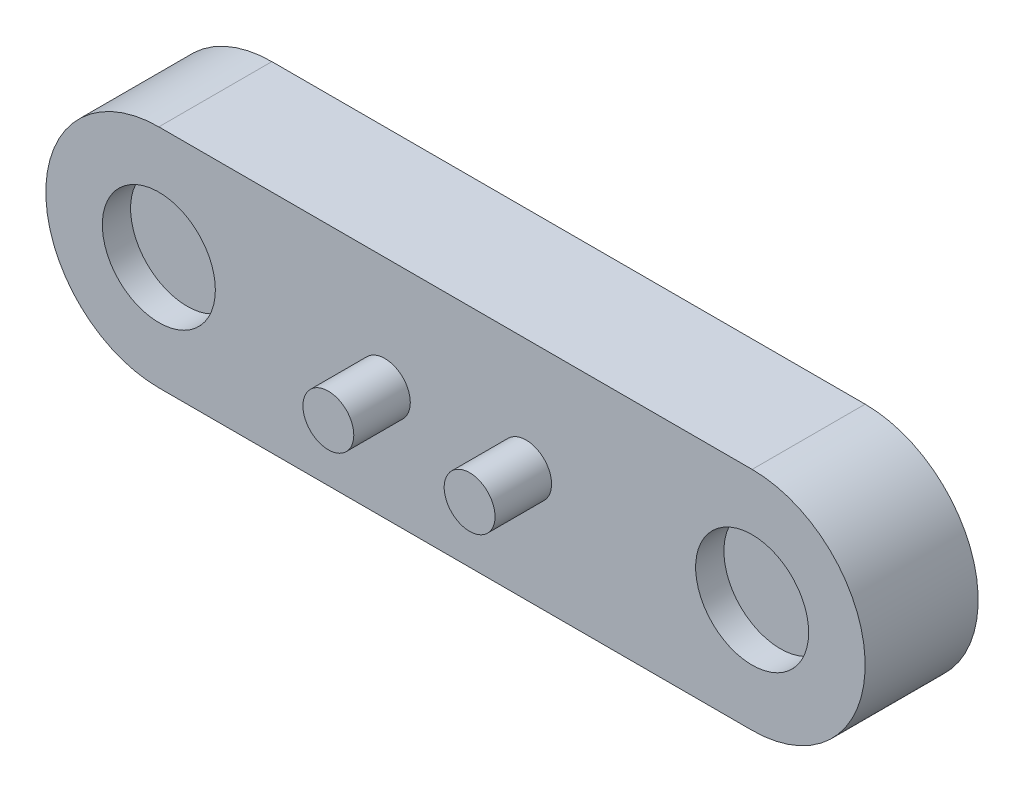
ISO-10303-21;
HEADER;
FILE_DESCRIPTION(('STEP AP214'),'2;1');
FILE_NAME('part.step','',(''),(''),'','','');
FILE_SCHEMA(('AUTOMOTIVE_DESIGN { 1 0 10303 214 1 1 1 1 }'));
ENDSEC;
DATA;
#1=APPLICATION_CONTEXT('core data for automotive mechanical design processes');
#2=APPLICATION_PROTOCOL_DEFINITION('international standard','automotive_design',2000,#1);
#3=PRODUCT_CONTEXT('',#1,'mechanical');
#4=PRODUCT('Part','Part','',(#3));
#5=PRODUCT_RELATED_PRODUCT_CATEGORY('part','',(#4));
#6=PRODUCT_DEFINITION_FORMATION('','',#4);
#7=PRODUCT_DEFINITION_CONTEXT('part definition',#1,'design');
#8=PRODUCT_DEFINITION('design','',#6,#7);
#9=PRODUCT_DEFINITION_SHAPE('','',#8);
#10=(LENGTH_UNIT() NAMED_UNIT(*) SI_UNIT(.MILLI.,.METRE.));
#11=(NAMED_UNIT(*) PLANE_ANGLE_UNIT() SI_UNIT($,.RADIAN.));
#12=(NAMED_UNIT(*) SI_UNIT($,.STERADIAN.) SOLID_ANGLE_UNIT());
#13=UNCERTAINTY_MEASURE_WITH_UNIT(LENGTH_MEASURE(1.E-05),#10,'distance_accuracy_value','');
#14=(GEOMETRIC_REPRESENTATION_CONTEXT(3) GLOBAL_UNCERTAINTY_ASSIGNED_CONTEXT((#13)) GLOBAL_UNIT_ASSIGNED_CONTEXT((#10,
#11,#12)) REPRESENTATION_CONTEXT('',''));
#15=CARTESIAN_POINT('',(0.,0.,0.));
#16=DIRECTION('',(0.,0.,1.));
#17=DIRECTION('',(1.,0.,0.));
#18=AXIS2_PLACEMENT_3D('',#15,#16,#17);
#19=CARTESIAN_POINT('',(10.5,0.,-2.));
#20=DIRECTION('',(0.,0.,1.));
#21=DIRECTION('',(1.,0.,0.));
#22=AXIS2_PLACEMENT_3D('',#19,#20,#21);
#23=CYLINDRICAL_SURFACE('',#22,2.);
#24=CARTESIAN_POINT('',(10.5,0.,0.));
#25=DIRECTION('',(0.,0.,1.));
#26=DIRECTION('',(1.,0.,0.));
#27=AXIS2_PLACEMENT_3D('',#24,#25,#26);
#28=CIRCLE('',#27,2.);
#29=CARTESIAN_POINT('',(10.5,-2.,0.));
#30=VERTEX_POINT('',#29);
#31=CARTESIAN_POINT('',(10.5,2.,0.));
#32=VERTEX_POINT('',#31);
#33=EDGE_CURVE('E110',#30,#32,#28,.T.);
#34=ORIENTED_EDGE('',*,*,#33,.F.);
#35=DIRECTION('',(0.,0.,1.));
#36=VECTOR('',#35,1.);
#37=CARTESIAN_POINT('',(10.5,-2.,-2.));
#38=LINE('',#37,#36);
#39=CARTESIAN_POINT('',(10.5,-2.,-2.));
#40=VERTEX_POINT('',#39);
#41=EDGE_CURVE('E11',#40,#30,#38,.T.);
#42=ORIENTED_EDGE('',*,*,#41,.F.);
#43=CARTESIAN_POINT('',(10.5,0.,-2.));
#44=DIRECTION('',(0.,0.,1.));
#45=DIRECTION('',(1.,0.,0.));
#46=AXIS2_PLACEMENT_3D('',#43,#44,#45);
#47=CIRCLE('',#46,2.);
#48=CARTESIAN_POINT('',(10.5,2.,-2.));
#49=VERTEX_POINT('',#48);
#50=EDGE_CURVE('E103',#40,#49,#47,.T.);
#51=ORIENTED_EDGE('',*,*,#50,.T.);
#52=DIRECTION('',(0.,0.,1.));
#53=VECTOR('',#52,1.);
#54=CARTESIAN_POINT('',(10.5,2.,-2.));
#55=LINE('',#54,#53);
#56=EDGE_CURVE('E48',#49,#32,#55,.T.);
#57=ORIENTED_EDGE('',*,*,#56,.T.);
#58=EDGE_LOOP('',(#34,#42,#51,#57));
#59=FACE_BOUND('',#58,.T.);
#60=ADVANCED_FACE('F45',(#59),#23,.T.);
#61=CARTESIAN_POINT('',(10.5,-2.,-2.));
#62=DIRECTION('',(0.,-1.,0.));
#63=DIRECTION('',(1.,0.,0.));
#64=AXIS2_PLACEMENT_3D('',#61,#62,#63);
#65=PLANE('',#64);
#66=DIRECTION('',(1.,0.,0.));
#67=VECTOR('',#66,1.);
#68=CARTESIAN_POINT('',(10.5,-2.,0.));
#69=LINE('',#68,#67);
#70=CARTESIAN_POINT('',(0.,-2.,0.));
#71=VERTEX_POINT('',#70);
#72=EDGE_CURVE('E105',#71,#30,#69,.T.);
#73=ORIENTED_EDGE('',*,*,#72,.F.);
#74=DIRECTION('',(0.,0.,1.));
#75=VECTOR('',#74,1.);
#76=CARTESIAN_POINT('',(0.,-2.,-2.));
#77=LINE('',#76,#75);
#78=CARTESIAN_POINT('',(0.,-2.,-2.));
#79=VERTEX_POINT('',#78);
#80=EDGE_CURVE('E54',#79,#71,#77,.T.);
#81=ORIENTED_EDGE('',*,*,#80,.F.);
#82=DIRECTION('',(1.,0.,0.));
#83=VECTOR('',#82,1.);
#84=CARTESIAN_POINT('',(10.5,-2.,-2.));
#85=LINE('',#84,#83);
#86=EDGE_CURVE('E100',#79,#40,#85,.T.);
#87=ORIENTED_EDGE('',*,*,#86,.T.);
#88=ORIENTED_EDGE('',*,*,#41,.T.);
#89=EDGE_LOOP('',(#73,#81,#87,#88));
#90=FACE_BOUND('',#89,.T.);
#91=ADVANCED_FACE('F121',(#90),#65,.T.);
#92=CARTESIAN_POINT('',(0.,0.,-2.));
#93=DIRECTION('',(0.,0.,1.));
#94=DIRECTION('',(1.,0.,0.));
#95=AXIS2_PLACEMENT_3D('',#92,#93,#94);
#96=CYLINDRICAL_SURFACE('',#95,2.);
#97=CARTESIAN_POINT('',(0.,0.,0.));
#98=DIRECTION('',(0.,0.,1.));
#99=DIRECTION('',(1.,0.,0.));
#100=AXIS2_PLACEMENT_3D('',#97,#98,#99);
#101=CIRCLE('',#100,2.);
#102=CARTESIAN_POINT('',(0.,2.,0.));
#103=VERTEX_POINT('',#102);
#104=EDGE_CURVE('E95',#103,#71,#101,.T.);
#105=ORIENTED_EDGE('',*,*,#104,.F.);
#106=DIRECTION('',(0.,0.,1.));
#107=VECTOR('',#106,1.);
#108=CARTESIAN_POINT('',(0.,2.,-2.));
#109=LINE('',#108,#107);
#110=CARTESIAN_POINT('',(0.,2.,-2.));
#111=VERTEX_POINT('',#110);
#112=EDGE_CURVE('E90',#111,#103,#109,.T.);
#113=ORIENTED_EDGE('',*,*,#112,.F.);
#114=CARTESIAN_POINT('',(0.,0.,-2.));
#115=DIRECTION('',(0.,0.,1.));
#116=DIRECTION('',(1.,0.,0.));
#117=AXIS2_PLACEMENT_3D('',#114,#115,#116);
#118=CIRCLE('',#117,2.);
#119=EDGE_CURVE('E93',#111,#79,#118,.T.);
#120=ORIENTED_EDGE('',*,*,#119,.T.);
#121=ORIENTED_EDGE('',*,*,#80,.T.);
#122=EDGE_LOOP('',(#105,#113,#120,#121));
#123=FACE_BOUND('',#122,.T.);
#124=ADVANCED_FACE('F92',(#123),#96,.T.);
#125=CARTESIAN_POINT('',(10.5,2.,-2.));
#126=DIRECTION('',(0.,1.,0.));
#127=DIRECTION('',(-1.,0.,0.));
#128=AXIS2_PLACEMENT_3D('',#125,#126,#127);
#129=PLANE('',#128);
#130=DIRECTION('',(-1.,0.,0.));
#131=VECTOR('',#130,1.);
#132=CARTESIAN_POINT('',(10.5,2.,0.));
#133=LINE('',#132,#131);
#134=EDGE_CURVE('E113',#32,#103,#133,.T.);
#135=ORIENTED_EDGE('',*,*,#134,.F.);
#136=ORIENTED_EDGE('',*,*,#56,.F.);
#137=DIRECTION('',(-1.,0.,0.));
#138=VECTOR('',#137,1.);
#139=CARTESIAN_POINT('',(10.5,2.,-2.));
#140=LINE('',#139,#138);
#141=EDGE_CURVE('E99',#49,#111,#140,.T.);
#142=ORIENTED_EDGE('',*,*,#141,.T.);
#143=ORIENTED_EDGE('',*,*,#112,.T.);
#144=EDGE_LOOP('',(#135,#136,#142,#143));
#145=FACE_BOUND('',#144,.T.);
#146=ADVANCED_FACE('F102',(#145),#129,.T.);
#147=CARTESIAN_POINT('',(10.5,0.,-2.));
#148=DIRECTION('',(0.,0.,1.));
#149=DIRECTION('',(1.,0.,0.));
#150=AXIS2_PLACEMENT_3D('',#147,#148,#149);
#151=PLANE('',#150);
#152=ORIENTED_EDGE('',*,*,#50,.F.);
#153=ORIENTED_EDGE('',*,*,#86,.F.);
#154=ORIENTED_EDGE('',*,*,#119,.F.);
#155=ORIENTED_EDGE('',*,*,#141,.F.);
#156=EDGE_LOOP('',(#152,#153,#154,#155));
#157=FACE_BOUND('',#156,.T.);
#158=ADVANCED_FACE('F98',(#157),#151,.F.);
#159=CARTESIAN_POINT('',(10.5,0.,0.));
#160=DIRECTION('',(0.,0.,1.));
#161=DIRECTION('',(1.,0.,0.));
#162=AXIS2_PLACEMENT_3D('',#159,#160,#161);
#163=PLANE('',#162);
#164=CARTESIAN_POINT('',(6.5,0.,0.));
#165=DIRECTION('',(0.,0.,1.));
#166=DIRECTION('',(1.,0.,0.));
#167=AXIS2_PLACEMENT_3D('',#164,#165,#166);
#168=CIRCLE('',#167,0.45);
#169=CARTESIAN_POINT('',(6.95,0.,0.));
#170=VERTEX_POINT('',#169);
#171=EDGE_CURVE('E179',#170,#170,#168,.T.);
#172=ORIENTED_EDGE('',*,*,#171,.F.);
#173=EDGE_LOOP('',(#172));
#174=FACE_BOUND('',#173,.T.);
#175=CARTESIAN_POINT('',(4.,0.,0.));
#176=DIRECTION('',(0.,0.,1.));
#177=DIRECTION('',(1.,0.,0.));
#178=AXIS2_PLACEMENT_3D('',#175,#176,#177);
#179=CIRCLE('',#178,0.45);
#180=CARTESIAN_POINT('',(4.45,0.,0.));
#181=VERTEX_POINT('',#180);
#182=EDGE_CURVE('E180',#181,#181,#179,.T.);
#183=ORIENTED_EDGE('',*,*,#182,.F.);
#184=EDGE_LOOP('',(#183));
#185=FACE_BOUND('',#184,.T.);
#186=CARTESIAN_POINT('',(0.,0.,0.));
#187=DIRECTION('',(0.,0.,1.));
#188=DIRECTION('',(1.,0.,0.));
#189=AXIS2_PLACEMENT_3D('',#186,#187,#188);
#190=CIRCLE('',#189,1.);
#191=CARTESIAN_POINT('',(1.,0.,0.));
#192=VERTEX_POINT('',#191);
#193=EDGE_CURVE('E192',#192,#192,#190,.T.);
#194=ORIENTED_EDGE('',*,*,#193,.F.);
#195=EDGE_LOOP('',(#194));
#196=FACE_BOUND('',#195,.T.);
#197=CARTESIAN_POINT('',(10.5,0.,0.));
#198=DIRECTION('',(0.,0.,1.));
#199=DIRECTION('',(1.,0.,0.));
#200=AXIS2_PLACEMENT_3D('',#197,#198,#199);
#201=CIRCLE('',#200,1.);
#202=CARTESIAN_POINT('',(11.5,0.,0.));
#203=VERTEX_POINT('',#202);
#204=EDGE_CURVE('E195',#203,#203,#201,.T.);
#205=ORIENTED_EDGE('',*,*,#204,.F.);
#206=EDGE_LOOP('',(#205));
#207=FACE_BOUND('',#206,.T.);
#208=ORIENTED_EDGE('',*,*,#33,.T.);
#209=ORIENTED_EDGE('',*,*,#134,.T.);
#210=ORIENTED_EDGE('',*,*,#104,.T.);
#211=ORIENTED_EDGE('',*,*,#72,.T.);
#212=EDGE_LOOP('',(#208,#209,#210,#211));
#213=FACE_BOUND('',#212,.T.);
#214=ADVANCED_FACE('F120',(#174,#185,#196,#207,#213),#163,.T.);
#215=CARTESIAN_POINT('',(10.5,0.,-0.5));
#216=DIRECTION('',(0.,0.,1.));
#217=DIRECTION('',(1.,0.,0.));
#218=AXIS2_PLACEMENT_3D('',#215,#216,#217);
#219=CYLINDRICAL_SURFACE('',#218,1.);
#220=CARTESIAN_POINT('',(10.5,0.,-0.5));
#221=DIRECTION('',(0.,0.,1.));
#222=DIRECTION('',(1.,0.,0.));
#223=AXIS2_PLACEMENT_3D('',#220,#221,#222);
#224=CIRCLE('',#223,1.);
#225=CARTESIAN_POINT('',(11.5,0.,-0.5));
#226=VERTEX_POINT('',#225);
#227=EDGE_CURVE('E188',#226,#226,#224,.T.);
#228=ORIENTED_EDGE('',*,*,#227,.F.);
#229=EDGE_LOOP('',(#228));
#230=FACE_BOUND('',#229,.T.);
#231=ORIENTED_EDGE('',*,*,#204,.T.);
#232=EDGE_LOOP('',(#231));
#233=FACE_BOUND('',#232,.T.);
#234=ADVANCED_FACE('F138',(#230,#233),#219,.F.);
#235=CARTESIAN_POINT('',(10.5,0.,-0.5));
#236=DIRECTION('',(0.,0.,1.));
#237=DIRECTION('',(1.,0.,0.));
#238=AXIS2_PLACEMENT_3D('',#235,#236,#237);
#239=PLANE('',#238);
#240=ORIENTED_EDGE('',*,*,#227,.T.);
#241=EDGE_LOOP('',(#240));
#242=FACE_BOUND('',#241,.T.);
#243=ADVANCED_FACE('F141',(#242),#239,.T.);
#244=CARTESIAN_POINT('',(0.,0.,-0.5));
#245=DIRECTION('',(0.,0.,1.));
#246=DIRECTION('',(1.,0.,0.));
#247=AXIS2_PLACEMENT_3D('',#244,#245,#246);
#248=CYLINDRICAL_SURFACE('',#247,1.);
#249=CARTESIAN_POINT('',(0.,0.,-0.5));
#250=DIRECTION('',(0.,0.,1.));
#251=DIRECTION('',(1.,0.,0.));
#252=AXIS2_PLACEMENT_3D('',#249,#250,#251);
#253=CIRCLE('',#252,1.);
#254=CARTESIAN_POINT('',(1.,0.,-0.5));
#255=VERTEX_POINT('',#254);
#256=EDGE_CURVE('E114',#255,#255,#253,.T.);
#257=ORIENTED_EDGE('',*,*,#256,.F.);
#258=EDGE_LOOP('',(#257));
#259=FACE_BOUND('',#258,.T.);
#260=ORIENTED_EDGE('',*,*,#193,.T.);
#261=EDGE_LOOP('',(#260));
#262=FACE_BOUND('',#261,.T.);
#263=ADVANCED_FACE('F144',(#259,#262),#248,.F.);
#264=CARTESIAN_POINT('',(0.,0.,-0.5));
#265=DIRECTION('',(0.,0.,1.));
#266=DIRECTION('',(1.,0.,0.));
#267=AXIS2_PLACEMENT_3D('',#264,#265,#266);
#268=PLANE('',#267);
#269=ORIENTED_EDGE('',*,*,#256,.T.);
#270=EDGE_LOOP('',(#269));
#271=FACE_BOUND('',#270,.T.);
#272=ADVANCED_FACE('F151',(#271),#268,.T.);
#273=CARTESIAN_POINT('',(4.,0.,1.));
#274=DIRECTION('',(0.,0.,-1.));
#275=DIRECTION('',(-1.,0.,0.));
#276=AXIS2_PLACEMENT_3D('',#273,#274,#275);
#277=CYLINDRICAL_SURFACE('',#276,0.45);
#278=CARTESIAN_POINT('',(4.,0.,1.));
#279=DIRECTION('',(0.,0.,1.));
#280=DIRECTION('',(1.,0.,0.));
#281=AXIS2_PLACEMENT_3D('',#278,#279,#280);
#282=CIRCLE('',#281,0.45);
#283=CARTESIAN_POINT('',(4.45,0.,1.));
#284=VERTEX_POINT('',#283);
#285=EDGE_CURVE('E183',#284,#284,#282,.T.);
#286=ORIENTED_EDGE('',*,*,#285,.F.);
#287=EDGE_LOOP('',(#286));
#288=FACE_BOUND('',#287,.T.);
#289=ORIENTED_EDGE('',*,*,#182,.T.);
#290=EDGE_LOOP('',(#289));
#291=FACE_BOUND('',#290,.T.);
#292=ADVANCED_FACE('F155',(#288,#291),#277,.T.);
#293=CARTESIAN_POINT('',(4.,0.,1.));
#294=DIRECTION('',(0.,0.,1.));
#295=DIRECTION('',(1.,0.,0.));
#296=AXIS2_PLACEMENT_3D('',#293,#294,#295);
#297=PLANE('',#296);
#298=ORIENTED_EDGE('',*,*,#285,.T.);
#299=EDGE_LOOP('',(#298));
#300=FACE_BOUND('',#299,.T.);
#301=ADVANCED_FACE('F159',(#300),#297,.T.);
#302=CARTESIAN_POINT('',(6.5,0.,1.));
#303=DIRECTION('',(0.,0.,-1.));
#304=DIRECTION('',(-1.,0.,0.));
#305=AXIS2_PLACEMENT_3D('',#302,#303,#304);
#306=CYLINDRICAL_SURFACE('',#305,0.45);
#307=CARTESIAN_POINT('',(6.5,0.,1.));
#308=DIRECTION('',(0.,0.,1.));
#309=DIRECTION('',(1.,0.,0.));
#310=AXIS2_PLACEMENT_3D('',#307,#308,#309);
#311=CIRCLE('',#310,0.45);
#312=CARTESIAN_POINT('',(6.95,0.,1.));
#313=VERTEX_POINT('',#312);
#314=EDGE_CURVE('E176',#313,#313,#311,.T.);
#315=ORIENTED_EDGE('',*,*,#314,.F.);
#316=EDGE_LOOP('',(#315));
#317=FACE_BOUND('',#316,.T.);
#318=ORIENTED_EDGE('',*,*,#171,.T.);
#319=EDGE_LOOP('',(#318));
#320=FACE_BOUND('',#319,.T.);
#321=ADVANCED_FACE('F163',(#317,#320),#306,.T.);
#322=CARTESIAN_POINT('',(6.5,0.,1.));
#323=DIRECTION('',(0.,0.,1.));
#324=DIRECTION('',(1.,0.,0.));
#325=AXIS2_PLACEMENT_3D('',#322,#323,#324);
#326=PLANE('',#325);
#327=ORIENTED_EDGE('',*,*,#314,.T.);
#328=EDGE_LOOP('',(#327));
#329=FACE_BOUND('',#328,.T.);
#330=ADVANCED_FACE('F165',(#329),#326,.T.);
#331=CLOSED_SHELL('',(#60,#91,#124,#146,#158,#214,#234,#243,#263,#272,#292,#301,#321,#330));
#332=MANIFOLD_SOLID_BREP('B2',#331);
#333=ADVANCED_BREP_SHAPE_REPRESENTATION('',(#18,#332),#14);
#334=SHAPE_DEFINITION_REPRESENTATION(#9,#333);
ENDSEC;
END-ISO-10303-21;
